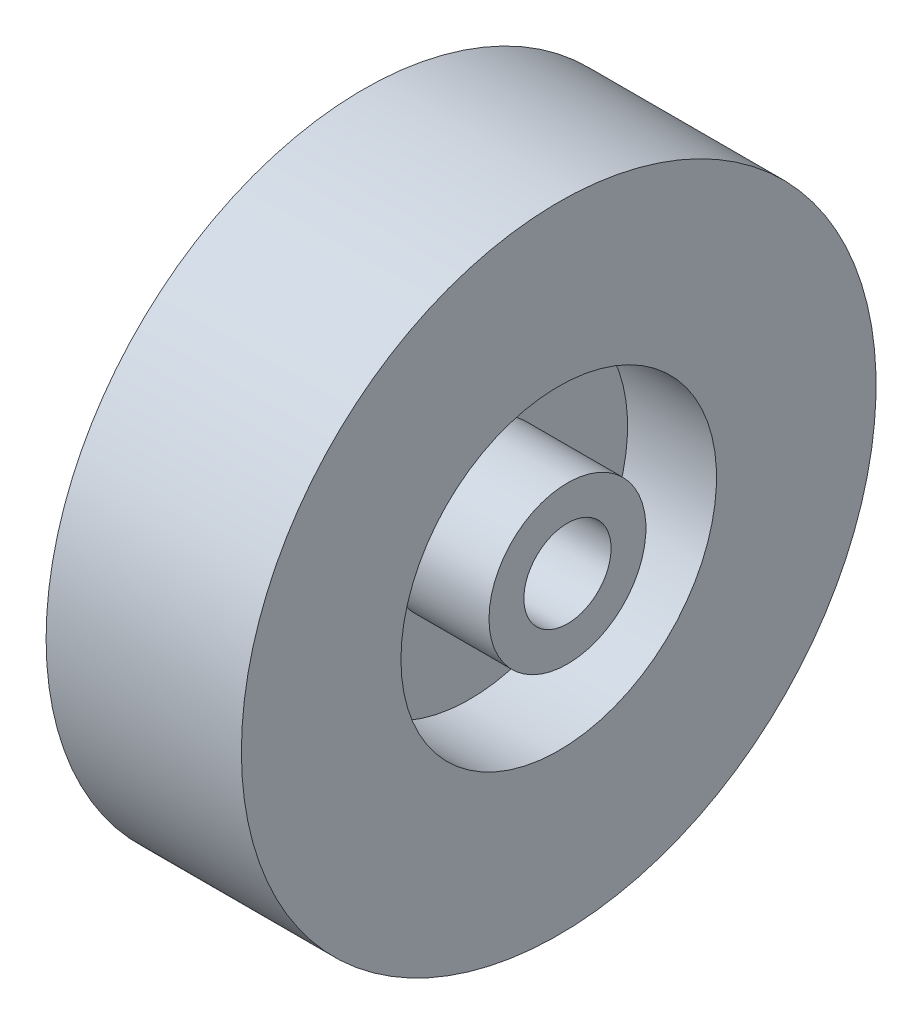
ISO-10303-21;
HEADER;
FILE_DESCRIPTION(('STEP AP214'),'2;1');
FILE_NAME('part.step','',(''),(''),'','','');
FILE_SCHEMA(('AUTOMOTIVE_DESIGN { 1 0 10303 214 1 1 1 1 }'));
ENDSEC;
DATA;
#1=APPLICATION_CONTEXT('core data for automotive mechanical design processes');
#2=APPLICATION_PROTOCOL_DEFINITION('international standard','automotive_design',2000,#1);
#3=PRODUCT_CONTEXT('',#1,'mechanical');
#4=PRODUCT('Part','Part','',(#3));
#5=PRODUCT_RELATED_PRODUCT_CATEGORY('part','',(#4));
#6=PRODUCT_DEFINITION_FORMATION('','',#4);
#7=PRODUCT_DEFINITION_CONTEXT('part definition',#1,'design');
#8=PRODUCT_DEFINITION('design','',#6,#7);
#9=PRODUCT_DEFINITION_SHAPE('','',#8);
#10=(LENGTH_UNIT() NAMED_UNIT(*) SI_UNIT(.MILLI.,.METRE.));
#11=(NAMED_UNIT(*) PLANE_ANGLE_UNIT() SI_UNIT($,.RADIAN.));
#12=(NAMED_UNIT(*) SI_UNIT($,.STERADIAN.) SOLID_ANGLE_UNIT());
#13=UNCERTAINTY_MEASURE_WITH_UNIT(LENGTH_MEASURE(1.E-05),#10,'distance_accuracy_value','');
#14=(GEOMETRIC_REPRESENTATION_CONTEXT(3) GLOBAL_UNCERTAINTY_ASSIGNED_CONTEXT((#13)) GLOBAL_UNIT_ASSIGNED_CONTEXT((#10,
#11,#12)) REPRESENTATION_CONTEXT('',''));
#15=CARTESIAN_POINT('',(0.,0.,0.));
#16=DIRECTION('',(0.,0.,1.));
#17=DIRECTION('',(1.,0.,0.));
#18=AXIS2_PLACEMENT_3D('',#15,#16,#17);
#19=CARTESIAN_POINT('',(0.,0.,0.));
#20=DIRECTION('',(-1.,0.,0.));
#21=DIRECTION('',(0.,0.,1.));
#22=AXIS2_PLACEMENT_3D('',#19,#20,#21);
#23=CYLINDRICAL_SURFACE('',#22,9.);
#24=CARTESIAN_POINT('',(0.999999999999998,0.,0.));
#25=DIRECTION('',(-1.,0.,0.));
#26=DIRECTION('',(0.,0.,1.));
#27=AXIS2_PLACEMENT_3D('',#24,#25,#26);
#28=CIRCLE('',#27,9.);
#29=CARTESIAN_POINT('',(0.999999999999998,0.,9.));
#30=VERTEX_POINT('',#29);
#31=EDGE_CURVE('E78',#30,#30,#28,.T.);
#32=ORIENTED_EDGE('',*,*,#31,.F.);
#33=EDGE_LOOP('',(#32));
#34=FACE_BOUND('',#33,.T.);
#35=CARTESIAN_POINT('',(12.2,0.,0.));
#36=DIRECTION('',(-1.,0.,0.));
#37=DIRECTION('',(0.,0.,1.));
#38=AXIS2_PLACEMENT_3D('',#35,#36,#37);
#39=CIRCLE('',#38,9.);
#40=CARTESIAN_POINT('',(12.2,0.,9.));
#41=VERTEX_POINT('',#40);
#42=EDGE_CURVE('E12',#41,#41,#39,.T.);
#43=ORIENTED_EDGE('',*,*,#42,.T.);
#44=EDGE_LOOP('',(#43));
#45=FACE_BOUND('',#44,.T.);
#46=ADVANCED_FACE('F44',(#34,#45),#23,.T.);
#47=CARTESIAN_POINT('',(12.2,9.,0.));
#48=DIRECTION('',(-1.,0.,0.));
#49=DIRECTION('',(0.,0.,1.));
#50=AXIS2_PLACEMENT_3D('',#47,#48,#49);
#51=PLANE('',#50);
#52=CARTESIAN_POINT('',(12.2,0.,0.));
#53=DIRECTION('',(1.,0.,0.));
#54=DIRECTION('',(0.,0.,-1.));
#55=AXIS2_PLACEMENT_3D('',#52,#53,#54);
#56=CIRCLE('',#55,5.);
#57=CARTESIAN_POINT('',(12.2,0.,-5.));
#58=VERTEX_POINT('',#57);
#59=EDGE_CURVE('E82',#58,#58,#56,.T.);
#60=ORIENTED_EDGE('',*,*,#59,.F.);
#61=EDGE_LOOP('',(#60));
#62=FACE_BOUND('',#61,.T.);
#63=ORIENTED_EDGE('',*,*,#42,.F.);
#64=EDGE_LOOP('',(#63));
#65=FACE_BOUND('',#64,.T.);
#66=ADVANCED_FACE('F97',(#62,#65),#51,.F.);
#67=CARTESIAN_POINT('',(-12.2,9.,0.));
#68=DIRECTION('',(1.,0.,0.));
#69=DIRECTION('',(0.,0.,-1.));
#70=AXIS2_PLACEMENT_3D('',#67,#68,#69);
#71=PLANE('',#70);
#72=CARTESIAN_POINT('',(-12.2,0.,0.));
#73=DIRECTION('',(-1.,0.,0.));
#74=DIRECTION('',(0.,0.,1.));
#75=AXIS2_PLACEMENT_3D('',#72,#73,#74);
#76=CIRCLE('',#75,9.);
#77=CARTESIAN_POINT('',(-12.2,0.,9.));
#78=VERTEX_POINT('',#77);
#79=EDGE_CURVE('E50',#78,#78,#76,.T.);
#80=ORIENTED_EDGE('',*,*,#79,.T.);
#81=EDGE_LOOP('',(#80));
#82=FACE_BOUND('',#81,.T.);
#83=ADVANCED_FACE('F100',(#82),#71,.F.);
#84=CARTESIAN_POINT('',(0.,0.,0.));
#85=DIRECTION('',(-1.,0.,0.));
#86=DIRECTION('',(0.,0.,1.));
#87=AXIS2_PLACEMENT_3D('',#84,#85,#86);
#88=CYLINDRICAL_SURFACE('',#87,9.);
#89=ORIENTED_EDGE('',*,*,#79,.F.);
#90=EDGE_LOOP('',(#89));
#91=FACE_BOUND('',#90,.T.);
#92=CARTESIAN_POINT('',(-0.999999999999997,0.,0.));
#93=DIRECTION('',(-1.,0.,0.));
#94=DIRECTION('',(0.,0.,1.));
#95=AXIS2_PLACEMENT_3D('',#92,#93,#94);
#96=CIRCLE('',#95,9.);
#97=CARTESIAN_POINT('',(-0.999999999999997,0.,9.));
#98=VERTEX_POINT('',#97);
#99=EDGE_CURVE('E54',#98,#98,#96,.T.);
#100=ORIENTED_EDGE('',*,*,#99,.T.);
#101=EDGE_LOOP('',(#100));
#102=FACE_BOUND('',#101,.T.);
#103=ADVANCED_FACE('F105',(#91,#102),#88,.T.);
#104=CARTESIAN_POINT('',(-0.999999999999998,18.1,0.));
#105=DIRECTION('',(1.,0.,0.));
#106=DIRECTION('',(0.,0.,-1.));
#107=AXIS2_PLACEMENT_3D('',#104,#105,#106);
#108=PLANE('',#107);
#109=ORIENTED_EDGE('',*,*,#99,.F.);
#110=EDGE_LOOP('',(#109));
#111=FACE_BOUND('',#110,.T.);
#112=CARTESIAN_POINT('',(-0.999999999999999,0.,0.));
#113=DIRECTION('',(-1.,0.,0.));
#114=DIRECTION('',(0.,0.,1.));
#115=AXIS2_PLACEMENT_3D('',#112,#113,#114);
#116=CIRCLE('',#115,18.1);
#117=CARTESIAN_POINT('',(-0.999999999999999,0.,18.1));
#118=VERTEX_POINT('',#117);
#119=EDGE_CURVE('E58',#118,#118,#116,.T.);
#120=ORIENTED_EDGE('',*,*,#119,.T.);
#121=EDGE_LOOP('',(#120));
#122=FACE_BOUND('',#121,.T.);
#123=ADVANCED_FACE('F111',(#111,#122),#108,.F.);
#124=CARTESIAN_POINT('',(0.,0.,0.));
#125=DIRECTION('',(-1.,0.,0.));
#126=DIRECTION('',(0.,0.,1.));
#127=AXIS2_PLACEMENT_3D('',#124,#125,#126);
#128=CYLINDRICAL_SURFACE('',#127,18.1);
#129=ORIENTED_EDGE('',*,*,#119,.F.);
#130=EDGE_LOOP('',(#129));
#131=FACE_BOUND('',#130,.T.);
#132=CARTESIAN_POINT('',(-11.2,0.,0.));
#133=DIRECTION('',(-1.,0.,0.));
#134=DIRECTION('',(0.,0.,1.));
#135=AXIS2_PLACEMENT_3D('',#132,#133,#134);
#136=CIRCLE('',#135,18.1);
#137=CARTESIAN_POINT('',(-11.2,0.,18.1));
#138=VERTEX_POINT('',#137);
#139=EDGE_CURVE('E63',#138,#138,#136,.T.);
#140=ORIENTED_EDGE('',*,*,#139,.T.);
#141=EDGE_LOOP('',(#140));
#142=FACE_BOUND('',#141,.T.);
#143=ADVANCED_FACE('F115',(#131,#142),#128,.F.);
#144=CARTESIAN_POINT('',(-11.2,36.4,0.));
#145=DIRECTION('',(1.,0.,0.));
#146=DIRECTION('',(0.,0.,-1.));
#147=AXIS2_PLACEMENT_3D('',#144,#145,#146);
#148=PLANE('',#147);
#149=ORIENTED_EDGE('',*,*,#139,.F.);
#150=EDGE_LOOP('',(#149));
#151=FACE_BOUND('',#150,.T.);
#152=CARTESIAN_POINT('',(-11.2,0.,0.));
#153=DIRECTION('',(-1.,0.,0.));
#154=DIRECTION('',(0.,0.,1.));
#155=AXIS2_PLACEMENT_3D('',#152,#153,#154);
#156=CIRCLE('',#155,36.4);
#157=CARTESIAN_POINT('',(-11.2,0.,36.4));
#158=VERTEX_POINT('',#157);
#159=EDGE_CURVE('E66',#158,#158,#156,.T.);
#160=ORIENTED_EDGE('',*,*,#159,.T.);
#161=EDGE_LOOP('',(#160));
#162=FACE_BOUND('',#161,.T.);
#163=ADVANCED_FACE('F119',(#151,#162),#148,.F.);
#164=CARTESIAN_POINT('',(0.,0.,0.));
#165=DIRECTION('',(-1.,0.,0.));
#166=DIRECTION('',(0.,0.,1.));
#167=AXIS2_PLACEMENT_3D('',#164,#165,#166);
#168=CYLINDRICAL_SURFACE('',#167,36.4);
#169=ORIENTED_EDGE('',*,*,#159,.F.);
#170=EDGE_LOOP('',(#169));
#171=FACE_BOUND('',#170,.T.);
#172=CARTESIAN_POINT('',(11.2,0.,0.));
#173=DIRECTION('',(-1.,0.,0.));
#174=DIRECTION('',(0.,0.,1.));
#175=AXIS2_PLACEMENT_3D('',#172,#173,#174);
#176=CIRCLE('',#175,36.4);
#177=CARTESIAN_POINT('',(11.2,0.,36.4));
#178=VERTEX_POINT('',#177);
#179=EDGE_CURVE('E69',#178,#178,#176,.T.);
#180=ORIENTED_EDGE('',*,*,#179,.T.);
#181=EDGE_LOOP('',(#180));
#182=FACE_BOUND('',#181,.T.);
#183=ADVANCED_FACE('F123',(#171,#182),#168,.T.);
#184=CARTESIAN_POINT('',(11.2,36.4,0.));
#185=DIRECTION('',(-1.,0.,0.));
#186=DIRECTION('',(0.,0.,1.));
#187=AXIS2_PLACEMENT_3D('',#184,#185,#186);
#188=PLANE('',#187);
#189=ORIENTED_EDGE('',*,*,#179,.F.);
#190=EDGE_LOOP('',(#189));
#191=FACE_BOUND('',#190,.T.);
#192=CARTESIAN_POINT('',(11.2,0.,0.));
#193=DIRECTION('',(-1.,0.,0.));
#194=DIRECTION('',(0.,0.,1.));
#195=AXIS2_PLACEMENT_3D('',#192,#193,#194);
#196=CIRCLE('',#195,18.1);
#197=CARTESIAN_POINT('',(11.2,0.,18.1));
#198=VERTEX_POINT('',#197);
#199=EDGE_CURVE('E72',#198,#198,#196,.T.);
#200=ORIENTED_EDGE('',*,*,#199,.T.);
#201=EDGE_LOOP('',(#200));
#202=FACE_BOUND('',#201,.T.);
#203=ADVANCED_FACE('F127',(#191,#202),#188,.F.);
#204=CARTESIAN_POINT('',(0.,0.,0.));
#205=DIRECTION('',(-1.,0.,0.));
#206=DIRECTION('',(0.,0.,1.));
#207=AXIS2_PLACEMENT_3D('',#204,#205,#206);
#208=CYLINDRICAL_SURFACE('',#207,18.1);
#209=ORIENTED_EDGE('',*,*,#199,.F.);
#210=EDGE_LOOP('',(#209));
#211=FACE_BOUND('',#210,.T.);
#212=CARTESIAN_POINT('',(1.,0.,0.));
#213=DIRECTION('',(-1.,0.,0.));
#214=DIRECTION('',(0.,0.,1.));
#215=AXIS2_PLACEMENT_3D('',#212,#213,#214);
#216=CIRCLE('',#215,18.1);
#217=CARTESIAN_POINT('',(1.,0.,18.1));
#218=VERTEX_POINT('',#217);
#219=EDGE_CURVE('E75',#218,#218,#216,.T.);
#220=ORIENTED_EDGE('',*,*,#219,.T.);
#221=EDGE_LOOP('',(#220));
#222=FACE_BOUND('',#221,.T.);
#223=ADVANCED_FACE('F131',(#211,#222),#208,.F.);
#224=CARTESIAN_POINT('',(1.,18.1,0.));
#225=DIRECTION('',(-1.,0.,0.));
#226=DIRECTION('',(0.,0.,1.));
#227=AXIS2_PLACEMENT_3D('',#224,#225,#226);
#228=PLANE('',#227);
#229=ORIENTED_EDGE('',*,*,#219,.F.);
#230=EDGE_LOOP('',(#229));
#231=FACE_BOUND('',#230,.T.);
#232=ORIENTED_EDGE('',*,*,#31,.T.);
#233=EDGE_LOOP('',(#232));
#234=FACE_BOUND('',#233,.T.);
#235=ADVANCED_FACE('F93',(#231,#234),#228,.F.);
#236=CARTESIAN_POINT('',(-2.8,0.,0.));
#237=DIRECTION('',(1.,0.,0.));
#238=DIRECTION('',(0.,0.,-1.));
#239=AXIS2_PLACEMENT_3D('',#236,#237,#238);
#240=CYLINDRICAL_SURFACE('',#239,5.);
#241=CARTESIAN_POINT('',(-2.8,0.,0.));
#242=DIRECTION('',(1.,0.,0.));
#243=DIRECTION('',(0.,0.,-1.));
#244=AXIS2_PLACEMENT_3D('',#241,#242,#243);
#245=CIRCLE('',#244,5.);
#246=CARTESIAN_POINT('',(-2.8,0.,-5.));
#247=VERTEX_POINT('',#246);
#248=EDGE_CURVE('E81',#247,#247,#245,.T.);
#249=ORIENTED_EDGE('',*,*,#248,.F.);
#250=EDGE_LOOP('',(#249));
#251=FACE_BOUND('',#250,.T.);
#252=ORIENTED_EDGE('',*,*,#59,.T.);
#253=EDGE_LOOP('',(#252));
#254=FACE_BOUND('',#253,.T.);
#255=ADVANCED_FACE('F90',(#251,#254),#240,.F.);
#256=CARTESIAN_POINT('',(-2.8,0.,0.));
#257=DIRECTION('',(1.,0.,0.));
#258=DIRECTION('',(0.,0.,-1.));
#259=AXIS2_PLACEMENT_3D('',#256,#257,#258);
#260=PLANE('',#259);
#261=ORIENTED_EDGE('',*,*,#248,.T.);
#262=EDGE_LOOP('',(#261));
#263=FACE_BOUND('',#262,.T.);
#264=ADVANCED_FACE('F88',(#263),#260,.T.);
#265=CLOSED_SHELL('',(#46,#66,#83,#103,#123,#143,#163,#183,#203,#223,#235,#255,#264));
#266=MANIFOLD_SOLID_BREP('B2',#265);
#267=ADVANCED_BREP_SHAPE_REPRESENTATION('',(#18,#266),#14);
#268=SHAPE_DEFINITION_REPRESENTATION(#9,#267);
ENDSEC;
END-ISO-10303-21;
